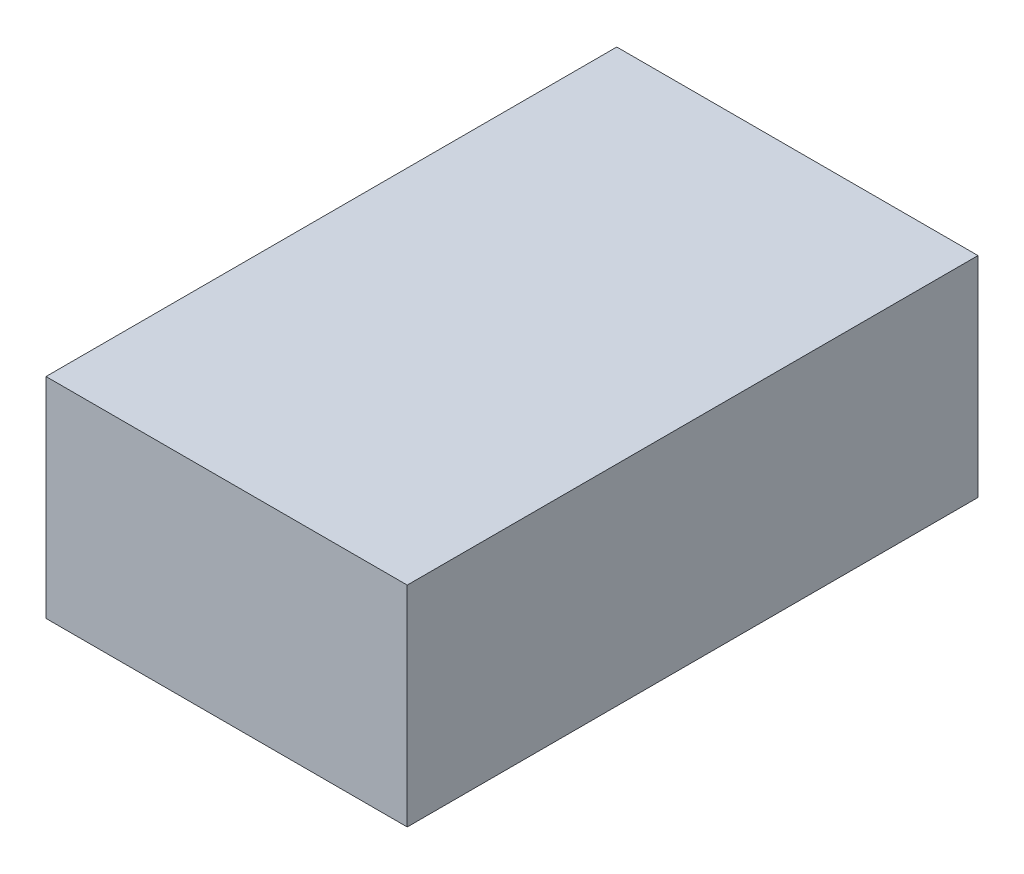
ISO-10303-21;
HEADER;
FILE_DESCRIPTION(('STEP AP214'),'2;1');
FILE_NAME('part.step','',(''),(''),'','','');
FILE_SCHEMA(('AUTOMOTIVE_DESIGN { 1 0 10303 214 1 1 1 1 }'));
ENDSEC;
DATA;
#1=APPLICATION_CONTEXT('core data for automotive mechanical design processes');
#2=APPLICATION_PROTOCOL_DEFINITION('international standard','automotive_design',2000,#1);
#3=PRODUCT_CONTEXT('',#1,'mechanical');
#4=PRODUCT('Part','Part','',(#3));
#5=PRODUCT_RELATED_PRODUCT_CATEGORY('part','',(#4));
#6=PRODUCT_DEFINITION_FORMATION('','',#4);
#7=PRODUCT_DEFINITION_CONTEXT('part definition',#1,'design');
#8=PRODUCT_DEFINITION('design','',#6,#7);
#9=PRODUCT_DEFINITION_SHAPE('','',#8);
#10=(LENGTH_UNIT() NAMED_UNIT(*) SI_UNIT(.MILLI.,.METRE.));
#11=(NAMED_UNIT(*) PLANE_ANGLE_UNIT() SI_UNIT($,.RADIAN.));
#12=(NAMED_UNIT(*) SI_UNIT($,.STERADIAN.) SOLID_ANGLE_UNIT());
#13=UNCERTAINTY_MEASURE_WITH_UNIT(LENGTH_MEASURE(1.E-05),#10,'distance_accuracy_value','');
#14=(GEOMETRIC_REPRESENTATION_CONTEXT(3) GLOBAL_UNCERTAINTY_ASSIGNED_CONTEXT((#13)) GLOBAL_UNIT_ASSIGNED_CONTEXT((#10,
#11,#12)) REPRESENTATION_CONTEXT('',''));
#15=CARTESIAN_POINT('',(0.,0.,0.));
#16=DIRECTION('',(0.,0.,1.));
#17=DIRECTION('',(1.,0.,0.));
#18=AXIS2_PLACEMENT_3D('',#15,#16,#17);
#19=CARTESIAN_POINT('',(-125.536393633323,145.,-218.170977384682));
#20=DIRECTION('',(0.,0.,-1.));
#21=DIRECTION('',(-1.,0.,0.));
#22=AXIS2_PLACEMENT_3D('',#19,#20,#21);
#23=PLANE('',#22);
#24=DIRECTION('',(1.,0.,0.));
#25=VECTOR('',#24,1.);
#26=CARTESIAN_POINT('',(-125.536393633323,0.,-218.170977384682));
#27=LINE('',#26,#25);
#28=CARTESIAN_POINT('',(-125.536393633323,0.,-218.170977384682));
#29=VERTEX_POINT('',#28);
#30=CARTESIAN_POINT('',(124.463606366677,0.,-218.170977384682));
#31=VERTEX_POINT('',#30);
#32=EDGE_CURVE('E98',#29,#31,#27,.T.);
#33=ORIENTED_EDGE('',*,*,#32,.F.);
#34=DIRECTION('',(0.,-1.,0.));
#35=VECTOR('',#34,1.);
#36=CARTESIAN_POINT('',(-125.536393633323,145.,-218.170977384682));
#37=LINE('',#36,#35);
#38=CARTESIAN_POINT('',(-125.536393633323,145.,-218.170977384682));
#39=VERTEX_POINT('',#38);
#40=EDGE_CURVE('E11',#39,#29,#37,.T.);
#41=ORIENTED_EDGE('',*,*,#40,.F.);
#42=DIRECTION('',(1.,0.,0.));
#43=VECTOR('',#42,1.);
#44=CARTESIAN_POINT('',(-125.536393633323,145.,-218.170977384682));
#45=LINE('',#44,#43);
#46=CARTESIAN_POINT('',(124.463606366677,145.,-218.170977384682));
#47=VERTEX_POINT('',#46);
#48=EDGE_CURVE('E92',#39,#47,#45,.T.);
#49=ORIENTED_EDGE('',*,*,#48,.T.);
#50=DIRECTION('',(0.,-1.,0.));
#51=VECTOR('',#50,1.);
#52=CARTESIAN_POINT('',(124.463606366677,145.,-218.170977384682));
#53=LINE('',#52,#51);
#54=EDGE_CURVE('E36',#47,#31,#53,.T.);
#55=ORIENTED_EDGE('',*,*,#54,.T.);
#56=EDGE_LOOP('',(#33,#41,#49,#55));
#57=FACE_BOUND('',#56,.T.);
#58=ADVANCED_FACE('F33',(#57),#23,.T.);
#59=CARTESIAN_POINT('',(-125.536393633323,145.,-218.170977384682));
#60=DIRECTION('',(1.,0.,0.));
#61=DIRECTION('',(0.,0.,-1.));
#62=AXIS2_PLACEMENT_3D('',#59,#60,#61);
#63=PLANE('',#62);
#64=DIRECTION('',(0.,0.,1.));
#65=VECTOR('',#64,1.);
#66=CARTESIAN_POINT('',(-125.536393633323,0.,-218.170977384682));
#67=LINE('',#66,#65);
#68=CARTESIAN_POINT('',(-125.536393633323,0.,176.829022615318));
#69=VERTEX_POINT('',#68);
#70=EDGE_CURVE('E94',#29,#69,#67,.T.);
#71=ORIENTED_EDGE('',*,*,#70,.T.);
#72=DIRECTION('',(0.,-1.,0.));
#73=VECTOR('',#72,1.);
#74=CARTESIAN_POINT('',(-125.536393633323,145.,176.829022615318));
#75=LINE('',#74,#73);
#76=CARTESIAN_POINT('',(-125.536393633323,145.,176.829022615318));
#77=VERTEX_POINT('',#76);
#78=EDGE_CURVE('E42',#77,#69,#75,.T.);
#79=ORIENTED_EDGE('',*,*,#78,.F.);
#80=DIRECTION('',(0.,0.,1.));
#81=VECTOR('',#80,1.);
#82=CARTESIAN_POINT('',(-125.536393633323,145.,-218.170977384682));
#83=LINE('',#82,#81);
#84=EDGE_CURVE('E89',#39,#77,#83,.T.);
#85=ORIENTED_EDGE('',*,*,#84,.F.);
#86=ORIENTED_EDGE('',*,*,#40,.T.);
#87=EDGE_LOOP('',(#71,#79,#85,#86));
#88=FACE_BOUND('',#87,.T.);
#89=ADVANCED_FACE('F105',(#88),#63,.F.);
#90=CARTESIAN_POINT('',(124.463606366677,145.,176.829022615318));
#91=DIRECTION('',(0.,0.,1.));
#92=DIRECTION('',(1.,0.,0.));
#93=AXIS2_PLACEMENT_3D('',#90,#91,#92);
#94=PLANE('',#93);
#95=DIRECTION('',(-1.,0.,0.));
#96=VECTOR('',#95,1.);
#97=CARTESIAN_POINT('',(124.463606366677,0.,176.829022615318));
#98=LINE('',#97,#96);
#99=CARTESIAN_POINT('',(124.463606366677,0.,176.829022615318));
#100=VERTEX_POINT('',#99);
#101=EDGE_CURVE('E83',#100,#69,#98,.T.);
#102=ORIENTED_EDGE('',*,*,#101,.F.);
#103=DIRECTION('',(0.,-1.,0.));
#104=VECTOR('',#103,1.);
#105=CARTESIAN_POINT('',(124.463606366677,145.,176.829022615318));
#106=LINE('',#105,#104);
#107=CARTESIAN_POINT('',(124.463606366677,145.,176.829022615318));
#108=VERTEX_POINT('',#107);
#109=EDGE_CURVE('E78',#108,#100,#106,.T.);
#110=ORIENTED_EDGE('',*,*,#109,.F.);
#111=DIRECTION('',(-1.,0.,0.));
#112=VECTOR('',#111,1.);
#113=CARTESIAN_POINT('',(124.463606366677,145.,176.829022615318));
#114=LINE('',#113,#112);
#115=EDGE_CURVE('E81',#108,#77,#114,.T.);
#116=ORIENTED_EDGE('',*,*,#115,.T.);
#117=ORIENTED_EDGE('',*,*,#78,.T.);
#118=EDGE_LOOP('',(#102,#110,#116,#117));
#119=FACE_BOUND('',#118,.T.);
#120=ADVANCED_FACE('F80',(#119),#94,.T.);
#121=CARTESIAN_POINT('',(124.463606366677,145.,-218.170977384682));
#122=DIRECTION('',(1.,0.,0.));
#123=DIRECTION('',(0.,0.,-1.));
#124=AXIS2_PLACEMENT_3D('',#121,#122,#123);
#125=PLANE('',#124);
#126=DIRECTION('',(0.,0.,1.));
#127=VECTOR('',#126,1.);
#128=CARTESIAN_POINT('',(124.463606366677,0.,-218.170977384682));
#129=LINE('',#128,#127);
#130=EDGE_CURVE('E101',#31,#100,#129,.T.);
#131=ORIENTED_EDGE('',*,*,#130,.F.);
#132=ORIENTED_EDGE('',*,*,#54,.F.);
#133=DIRECTION('',(0.,0.,1.));
#134=VECTOR('',#133,1.);
#135=CARTESIAN_POINT('',(124.463606366677,145.,-218.170977384682));
#136=LINE('',#135,#134);
#137=EDGE_CURVE('E88',#47,#108,#136,.T.);
#138=ORIENTED_EDGE('',*,*,#137,.T.);
#139=ORIENTED_EDGE('',*,*,#109,.T.);
#140=EDGE_LOOP('',(#131,#132,#138,#139));
#141=FACE_BOUND('',#140,.T.);
#142=ADVANCED_FACE('F91',(#141),#125,.T.);
#143=CARTESIAN_POINT('',(0.,145.,0.));
#144=DIRECTION('',(0.,-1.,0.));
#145=DIRECTION('',(0.,0.,-1.));
#146=AXIS2_PLACEMENT_3D('',#143,#144,#145);
#147=PLANE('',#146);
#148=ORIENTED_EDGE('',*,*,#48,.F.);
#149=ORIENTED_EDGE('',*,*,#84,.T.);
#150=ORIENTED_EDGE('',*,*,#115,.F.);
#151=ORIENTED_EDGE('',*,*,#137,.F.);
#152=EDGE_LOOP('',(#148,#149,#150,#151));
#153=FACE_BOUND('',#152,.T.);
#154=ADVANCED_FACE('F87',(#153),#147,.F.);
#155=CARTESIAN_POINT('',(0.,0.,0.));
#156=DIRECTION('',(0.,-1.,0.));
#157=DIRECTION('',(0.,0.,-1.));
#158=AXIS2_PLACEMENT_3D('',#155,#156,#157);
#159=PLANE('',#158);
#160=ORIENTED_EDGE('',*,*,#32,.T.);
#161=ORIENTED_EDGE('',*,*,#130,.T.);
#162=ORIENTED_EDGE('',*,*,#101,.T.);
#163=ORIENTED_EDGE('',*,*,#70,.F.);
#164=EDGE_LOOP('',(#160,#161,#162,#163));
#165=FACE_BOUND('',#164,.T.);
#166=ADVANCED_FACE('F107',(#165),#159,.T.);
#167=CLOSED_SHELL('',(#58,#89,#120,#142,#154,#166));
#168=MANIFOLD_SOLID_BREP('B2',#167);
#169=ADVANCED_BREP_SHAPE_REPRESENTATION('',(#18,#168),#14);
#170=SHAPE_DEFINITION_REPRESENTATION(#9,#169);
ENDSEC;
END-ISO-10303-21;
